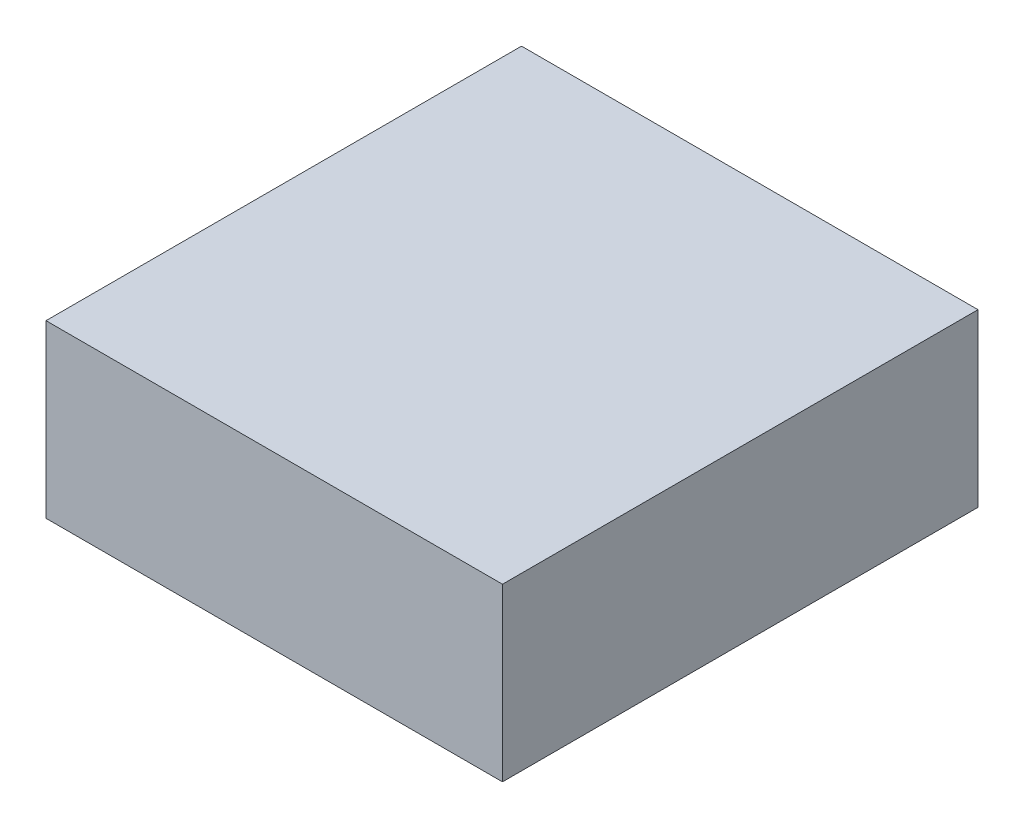
ISO-10303-21;
HEADER;
FILE_DESCRIPTION(('STEP AP214'),'2;1');
FILE_NAME('part.step','',(''),(''),'','','');
FILE_SCHEMA(('AUTOMOTIVE_DESIGN { 1 0 10303 214 1 1 1 1 }'));
ENDSEC;
DATA;
#1=APPLICATION_CONTEXT('core data for automotive mechanical design processes');
#2=APPLICATION_PROTOCOL_DEFINITION('international standard','automotive_design',2000,#1);
#3=PRODUCT_CONTEXT('',#1,'mechanical');
#4=PRODUCT('Part','Part','',(#3));
#5=PRODUCT_RELATED_PRODUCT_CATEGORY('part','',(#4));
#6=PRODUCT_DEFINITION_FORMATION('','',#4);
#7=PRODUCT_DEFINITION_CONTEXT('part definition',#1,'design');
#8=PRODUCT_DEFINITION('design','',#6,#7);
#9=PRODUCT_DEFINITION_SHAPE('','',#8);
#10=(LENGTH_UNIT() NAMED_UNIT(*) SI_UNIT(.MILLI.,.METRE.));
#11=(NAMED_UNIT(*) PLANE_ANGLE_UNIT() SI_UNIT($,.RADIAN.));
#12=(NAMED_UNIT(*) SI_UNIT($,.STERADIAN.) SOLID_ANGLE_UNIT());
#13=UNCERTAINTY_MEASURE_WITH_UNIT(LENGTH_MEASURE(1.E-05),#10,'distance_accuracy_value','');
#14=(GEOMETRIC_REPRESENTATION_CONTEXT(3) GLOBAL_UNCERTAINTY_ASSIGNED_CONTEXT((#13)) GLOBAL_UNIT_ASSIGNED_CONTEXT((#10,
#11,#12)) REPRESENTATION_CONTEXT('',''));
#15=CARTESIAN_POINT('',(0.,0.,0.));
#16=DIRECTION('',(0.,0.,1.));
#17=DIRECTION('',(1.,0.,0.));
#18=AXIS2_PLACEMENT_3D('',#15,#16,#17);
#19=CARTESIAN_POINT('',(12.,9.,-12.5));
#20=DIRECTION('',(-1.,0.,0.));
#21=DIRECTION('',(0.,0.,1.));
#22=AXIS2_PLACEMENT_3D('',#19,#20,#21);
#23=PLANE('',#22);
#24=DIRECTION('',(0.,0.,-1.));
#25=VECTOR('',#24,1.);
#26=CARTESIAN_POINT('',(12.,0.,-12.5));
#27=LINE('',#26,#25);
#28=CARTESIAN_POINT('',(12.,0.,12.5));
#29=VERTEX_POINT('',#28);
#30=CARTESIAN_POINT('',(12.,0.,-12.5));
#31=VERTEX_POINT('',#30);
#32=EDGE_CURVE('E106',#29,#31,#27,.T.);
#33=ORIENTED_EDGE('',*,*,#32,.T.);
#34=DIRECTION('',(0.,-1.,0.));
#35=VECTOR('',#34,1.);
#36=CARTESIAN_POINT('',(12.,9.,-12.5));
#37=LINE('',#36,#35);
#38=CARTESIAN_POINT('',(12.,9.,-12.5));
#39=VERTEX_POINT('',#38);
#40=EDGE_CURVE('E11',#39,#31,#37,.T.);
#41=ORIENTED_EDGE('',*,*,#40,.F.);
#42=DIRECTION('',(0.,0.,-1.));
#43=VECTOR('',#42,1.);
#44=CARTESIAN_POINT('',(12.,9.,-12.5));
#45=LINE('',#44,#43);
#46=CARTESIAN_POINT('',(12.,9.,12.5));
#47=VERTEX_POINT('',#46);
#48=EDGE_CURVE('E92',#47,#39,#45,.T.);
#49=ORIENTED_EDGE('',*,*,#48,.F.);
#50=DIRECTION('',(0.,-1.,0.));
#51=VECTOR('',#50,1.);
#52=CARTESIAN_POINT('',(12.,9.,12.5));
#53=LINE('',#52,#51);
#54=EDGE_CURVE('E105',#47,#29,#53,.T.);
#55=ORIENTED_EDGE('',*,*,#54,.T.);
#56=EDGE_LOOP('',(#33,#41,#49,#55));
#57=FACE_BOUND('',#56,.T.);
#58=ADVANCED_FACE('F43',(#57),#23,.F.);
#59=CARTESIAN_POINT('',(-12.,9.,-12.5));
#60=DIRECTION('',(0.,0.,1.));
#61=DIRECTION('',(1.,0.,0.));
#62=AXIS2_PLACEMENT_3D('',#59,#60,#61);
#63=PLANE('',#62);
#64=DIRECTION('',(-1.,0.,0.));
#65=VECTOR('',#64,1.);
#66=CARTESIAN_POINT('',(-12.,0.,-12.5));
#67=LINE('',#66,#65);
#68=CARTESIAN_POINT('',(-12.,0.,-12.5));
#69=VERTEX_POINT('',#68);
#70=EDGE_CURVE('E97',#31,#69,#67,.T.);
#71=ORIENTED_EDGE('',*,*,#70,.T.);
#72=DIRECTION('',(0.,-1.,0.));
#73=VECTOR('',#72,1.);
#74=CARTESIAN_POINT('',(-12.,9.,-12.5));
#75=LINE('',#74,#73);
#76=CARTESIAN_POINT('',(-12.,9.,-12.5));
#77=VERTEX_POINT('',#76);
#78=EDGE_CURVE('E51',#77,#69,#75,.T.);
#79=ORIENTED_EDGE('',*,*,#78,.F.);
#80=DIRECTION('',(-1.,0.,0.));
#81=VECTOR('',#80,1.);
#82=CARTESIAN_POINT('',(-12.,9.,-12.5));
#83=LINE('',#82,#81);
#84=EDGE_CURVE('E87',#39,#77,#83,.T.);
#85=ORIENTED_EDGE('',*,*,#84,.F.);
#86=ORIENTED_EDGE('',*,*,#40,.T.);
#87=EDGE_LOOP('',(#71,#79,#85,#86));
#88=FACE_BOUND('',#87,.T.);
#89=ADVANCED_FACE('F100',(#88),#63,.F.);
#90=CARTESIAN_POINT('',(-12.,9.,-12.5));
#91=DIRECTION('',(1.,0.,0.));
#92=DIRECTION('',(0.,0.,-1.));
#93=AXIS2_PLACEMENT_3D('',#90,#91,#92);
#94=PLANE('',#93);
#95=DIRECTION('',(0.,0.,1.));
#96=VECTOR('',#95,1.);
#97=CARTESIAN_POINT('',(-12.,0.,-12.5));
#98=LINE('',#97,#96);
#99=CARTESIAN_POINT('',(-12.,0.,12.5));
#100=VERTEX_POINT('',#99);
#101=EDGE_CURVE('E78',#69,#100,#98,.T.);
#102=ORIENTED_EDGE('',*,*,#101,.T.);
#103=DIRECTION('',(0.,-1.,0.));
#104=VECTOR('',#103,1.);
#105=CARTESIAN_POINT('',(-12.,9.,12.5));
#106=LINE('',#105,#104);
#107=CARTESIAN_POINT('',(-12.,9.,12.5));
#108=VERTEX_POINT('',#107);
#109=EDGE_CURVE('E98',#108,#100,#106,.T.);
#110=ORIENTED_EDGE('',*,*,#109,.F.);
#111=DIRECTION('',(0.,0.,1.));
#112=VECTOR('',#111,1.);
#113=CARTESIAN_POINT('',(-12.,9.,-12.5));
#114=LINE('',#113,#112);
#115=EDGE_CURVE('E95',#77,#108,#114,.T.);
#116=ORIENTED_EDGE('',*,*,#115,.F.);
#117=ORIENTED_EDGE('',*,*,#78,.T.);
#118=EDGE_LOOP('',(#102,#110,#116,#117));
#119=FACE_BOUND('',#118,.T.);
#120=ADVANCED_FACE('F99',(#119),#94,.F.);
#121=CARTESIAN_POINT('',(-12.,9.,12.5));
#122=DIRECTION('',(0.,0.,-1.));
#123=DIRECTION('',(-1.,0.,0.));
#124=AXIS2_PLACEMENT_3D('',#121,#122,#123);
#125=PLANE('',#124);
#126=DIRECTION('',(1.,0.,0.));
#127=VECTOR('',#126,1.);
#128=CARTESIAN_POINT('',(-12.,0.,12.5));
#129=LINE('',#128,#127);
#130=EDGE_CURVE('E85',#100,#29,#129,.T.);
#131=ORIENTED_EDGE('',*,*,#130,.T.);
#132=ORIENTED_EDGE('',*,*,#54,.F.);
#133=DIRECTION('',(1.,0.,0.));
#134=VECTOR('',#133,1.);
#135=CARTESIAN_POINT('',(-12.,9.,12.5));
#136=LINE('',#135,#134);
#137=EDGE_CURVE('E56',#108,#47,#136,.T.);
#138=ORIENTED_EDGE('',*,*,#137,.F.);
#139=ORIENTED_EDGE('',*,*,#109,.T.);
#140=EDGE_LOOP('',(#131,#132,#138,#139));
#141=FACE_BOUND('',#140,.T.);
#142=ADVANCED_FACE('F111',(#141),#125,.F.);
#143=CARTESIAN_POINT('',(0.,9.,0.));
#144=DIRECTION('',(0.,1.,0.));
#145=DIRECTION('',(0.,0.,1.));
#146=AXIS2_PLACEMENT_3D('',#143,#144,#145);
#147=PLANE('',#146);
#148=ORIENTED_EDGE('',*,*,#48,.T.);
#149=ORIENTED_EDGE('',*,*,#84,.T.);
#150=ORIENTED_EDGE('',*,*,#115,.T.);
#151=ORIENTED_EDGE('',*,*,#137,.T.);
#152=EDGE_LOOP('',(#148,#149,#150,#151));
#153=FACE_BOUND('',#152,.T.);
#154=ADVANCED_FACE('F89',(#153),#147,.T.);
#155=CARTESIAN_POINT('',(0.,0.,0.));
#156=DIRECTION('',(0.,1.,0.));
#157=DIRECTION('',(0.,0.,1.));
#158=AXIS2_PLACEMENT_3D('',#155,#156,#157);
#159=PLANE('',#158);
#160=ORIENTED_EDGE('',*,*,#32,.F.);
#161=ORIENTED_EDGE('',*,*,#130,.F.);
#162=ORIENTED_EDGE('',*,*,#101,.F.);
#163=ORIENTED_EDGE('',*,*,#70,.F.);
#164=EDGE_LOOP('',(#160,#161,#162,#163));
#165=FACE_BOUND('',#164,.T.);
#166=ADVANCED_FACE('F116',(#165),#159,.F.);
#167=CLOSED_SHELL('',(#58,#89,#120,#142,#154,#166));
#168=MANIFOLD_SOLID_BREP('B2',#167);
#169=ADVANCED_BREP_SHAPE_REPRESENTATION('',(#18,#168),#14);
#170=SHAPE_DEFINITION_REPRESENTATION(#9,#169);
ENDSEC;
END-ISO-10303-21;
